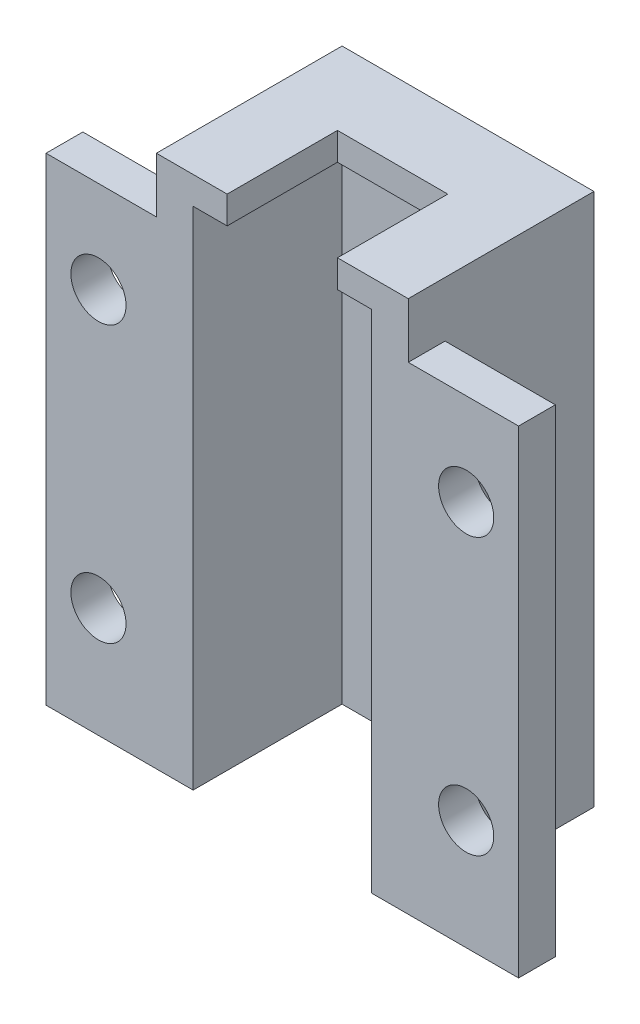
ISO-10303-21;
HEADER;
FILE_DESCRIPTION(('STEP AP214'),'2;1');
FILE_NAME('part.step','',(''),(''),'','','');
FILE_SCHEMA(('AUTOMOTIVE_DESIGN { 1 0 10303 214 1 1 1 1 }'));
ENDSEC;
DATA;
#1=APPLICATION_CONTEXT('core data for automotive mechanical design processes');
#2=APPLICATION_PROTOCOL_DEFINITION('international standard','automotive_design',2000,#1);
#3=PRODUCT_CONTEXT('',#1,'mechanical');
#4=PRODUCT('Part','Part','',(#3));
#5=PRODUCT_RELATED_PRODUCT_CATEGORY('part','',(#4));
#6=PRODUCT_DEFINITION_FORMATION('','',#4);
#7=PRODUCT_DEFINITION_CONTEXT('part definition',#1,'design');
#8=PRODUCT_DEFINITION('design','',#6,#7);
#9=PRODUCT_DEFINITION_SHAPE('','',#8);
#10=(LENGTH_UNIT() NAMED_UNIT(*) SI_UNIT(.MILLI.,.METRE.));
#11=(NAMED_UNIT(*) PLANE_ANGLE_UNIT() SI_UNIT($,.RADIAN.));
#12=(NAMED_UNIT(*) SI_UNIT($,.STERADIAN.) SOLID_ANGLE_UNIT());
#13=UNCERTAINTY_MEASURE_WITH_UNIT(LENGTH_MEASURE(1.E-05),#10,'distance_accuracy_value','');
#14=(GEOMETRIC_REPRESENTATION_CONTEXT(3) GLOBAL_UNCERTAINTY_ASSIGNED_CONTEXT((#13)) GLOBAL_UNIT_ASSIGNED_CONTEXT((#10,
#11,#12)) REPRESENTATION_CONTEXT('',''));
#15=CARTESIAN_POINT('',(0.,0.,0.));
#16=DIRECTION('',(0.,0.,1.));
#17=DIRECTION('',(1.,0.,0.));
#18=AXIS2_PLACEMENT_3D('',#15,#16,#17);
#19=CARTESIAN_POINT('',(6.1595,-36.83,0.));
#20=DIRECTION('',(-1.,0.,0.));
#21=DIRECTION('',(0.,0.,1.));
#22=AXIS2_PLACEMENT_3D('',#19,#20,#21);
#23=PLANE('',#22);
#24=DIRECTION('',(0.,1.,0.));
#25=VECTOR('',#24,1.);
#26=CARTESIAN_POINT('',(6.1595,-36.83,0.));
#27=LINE('',#26,#25);
#28=CARTESIAN_POINT('',(6.1595,-36.83,0.));
#29=VERTEX_POINT('',#28);
#30=CARTESIAN_POINT('',(6.1595,-1.905,0.));
#31=VERTEX_POINT('',#30);
#32=EDGE_CURVE('E156',#29,#31,#27,.T.);
#33=ORIENTED_EDGE('',*,*,#32,.T.);
#34=DIRECTION('',(0.,0.,-1.));
#35=VECTOR('',#34,1.);
#36=CARTESIAN_POINT('',(6.1595,-1.905,0.));
#37=LINE('',#36,#35);
#38=CARTESIAN_POINT('',(6.1595,-1.905,-10.287));
#39=VERTEX_POINT('',#38);
#40=EDGE_CURVE('E135',#31,#39,#37,.T.);
#41=ORIENTED_EDGE('',*,*,#40,.T.);
#42=DIRECTION('',(0.,1.,0.));
#43=VECTOR('',#42,1.);
#44=CARTESIAN_POINT('',(6.1595,-36.83,-10.287));
#45=LINE('',#44,#43);
#46=CARTESIAN_POINT('',(6.1595,-36.83,-10.287));
#47=VERTEX_POINT('',#46);
#48=EDGE_CURVE('E159',#47,#39,#45,.T.);
#49=ORIENTED_EDGE('',*,*,#48,.F.);
#50=DIRECTION('',(0.,0.,1.));
#51=VECTOR('',#50,1.);
#52=CARTESIAN_POINT('',(6.1595,-36.83,0.));
#53=LINE('',#52,#51);
#54=EDGE_CURVE('E249',#47,#29,#53,.T.);
#55=ORIENTED_EDGE('',*,*,#54,.T.);
#56=EDGE_LOOP('',(#33,#41,#49,#55));
#57=FACE_BOUND('',#56,.T.);
#58=ADVANCED_FACE('F33',(#57),#23,.T.);
#59=CARTESIAN_POINT('',(6.1595,-36.83,-10.287));
#60=DIRECTION('',(0.,0.,1.));
#61=DIRECTION('',(1.,0.,0.));
#62=AXIS2_PLACEMENT_3D('',#59,#60,#61);
#63=PLANE('',#62);
#64=ORIENTED_EDGE('',*,*,#48,.T.);
#65=DIRECTION('',(-1.,0.,0.));
#66=VECTOR('',#65,1.);
#67=CARTESIAN_POINT('',(6.1595,-1.905,-10.287));
#68=LINE('',#67,#66);
#69=CARTESIAN_POINT('',(-6.1595,-1.905,-10.287));
#70=VERTEX_POINT('',#69);
#71=EDGE_CURVE('E232',#39,#70,#68,.T.);
#72=ORIENTED_EDGE('',*,*,#71,.T.);
#73=DIRECTION('',(0.,1.,0.));
#74=VECTOR('',#73,1.);
#75=CARTESIAN_POINT('',(-6.1595,-36.83,-10.287));
#76=LINE('',#75,#74);
#77=CARTESIAN_POINT('',(-6.1595,-36.83,-10.287));
#78=VERTEX_POINT('',#77);
#79=EDGE_CURVE('E162',#78,#70,#76,.T.);
#80=ORIENTED_EDGE('',*,*,#79,.F.);
#81=DIRECTION('',(1.,0.,0.));
#82=VECTOR('',#81,1.);
#83=CARTESIAN_POINT('',(-6.1595,-36.83,-10.287));
#84=LINE('',#83,#82);
#85=EDGE_CURVE('E246',#78,#47,#84,.T.);
#86=ORIENTED_EDGE('',*,*,#85,.T.);
#87=EDGE_LOOP('',(#64,#72,#80,#86));
#88=FACE_BOUND('',#87,.T.);
#89=ADVANCED_FACE('F244',(#88),#63,.T.);
#90=CARTESIAN_POINT('',(-6.1595,-36.83,0.));
#91=DIRECTION('',(1.,0.,0.));
#92=DIRECTION('',(0.,0.,-1.));
#93=AXIS2_PLACEMENT_3D('',#90,#91,#92);
#94=PLANE('',#93);
#95=ORIENTED_EDGE('',*,*,#79,.T.);
#96=DIRECTION('',(0.,0.,1.));
#97=VECTOR('',#96,1.);
#98=CARTESIAN_POINT('',(-6.1595,-1.905,0.));
#99=LINE('',#98,#97);
#100=CARTESIAN_POINT('',(-6.1595,-1.905,0.));
#101=VERTEX_POINT('',#100);
#102=EDGE_CURVE('E230',#70,#101,#99,.T.);
#103=ORIENTED_EDGE('',*,*,#102,.T.);
#104=DIRECTION('',(0.,1.,0.));
#105=VECTOR('',#104,1.);
#106=CARTESIAN_POINT('',(-6.1595,-36.83,0.));
#107=LINE('',#106,#105);
#108=CARTESIAN_POINT('',(-6.1595,-36.83,0.));
#109=VERTEX_POINT('',#108);
#110=EDGE_CURVE('E164',#109,#101,#107,.T.);
#111=ORIENTED_EDGE('',*,*,#110,.F.);
#112=DIRECTION('',(0.,0.,-1.));
#113=VECTOR('',#112,1.);
#114=CARTESIAN_POINT('',(-6.1595,-36.83,0.));
#115=LINE('',#114,#113);
#116=EDGE_CURVE('E250',#109,#78,#115,.T.);
#117=ORIENTED_EDGE('',*,*,#116,.T.);
#118=EDGE_LOOP('',(#95,#103,#111,#117));
#119=FACE_BOUND('',#118,.T.);
#120=ADVANCED_FACE('F319',(#119),#94,.T.);
#121=CARTESIAN_POINT('',(-16.3195,-36.83,-2.54));
#122=DIRECTION('',(-1.,0.,0.));
#123=DIRECTION('',(0.,0.,1.));
#124=AXIS2_PLACEMENT_3D('',#121,#122,#123);
#125=PLANE('',#124);
#126=DIRECTION('',(0.,0.,-1.));
#127=VECTOR('',#126,1.);
#128=CARTESIAN_POINT('',(-16.3195,-3.81,0.));
#129=LINE('',#128,#127);
#130=CARTESIAN_POINT('',(-16.3195,-3.81,0.));
#131=VERTEX_POINT('',#130);
#132=CARTESIAN_POINT('',(-16.3195,-3.81,-2.54));
#133=VERTEX_POINT('',#132);
#134=EDGE_CURVE('E171',#131,#133,#129,.T.);
#135=ORIENTED_EDGE('',*,*,#134,.T.);
#136=DIRECTION('',(0.,1.,0.));
#137=VECTOR('',#136,1.);
#138=CARTESIAN_POINT('',(-16.3195,-36.83,-2.54));
#139=LINE('',#138,#137);
#140=CARTESIAN_POINT('',(-16.3195,-36.83,-2.54));
#141=VERTEX_POINT('',#140);
#142=EDGE_CURVE('E11',#141,#133,#139,.T.);
#143=ORIENTED_EDGE('',*,*,#142,.F.);
#144=DIRECTION('',(0.,0.,1.));
#145=VECTOR('',#144,1.);
#146=CARTESIAN_POINT('',(-16.3195,-36.83,-2.54));
#147=LINE('',#146,#145);
#148=CARTESIAN_POINT('',(-16.3195,-36.83,0.));
#149=VERTEX_POINT('',#148);
#150=EDGE_CURVE('E143',#141,#149,#147,.T.);
#151=ORIENTED_EDGE('',*,*,#150,.T.);
#152=DIRECTION('',(0.,1.,0.));
#153=VECTOR('',#152,1.);
#154=CARTESIAN_POINT('',(-16.3195,-36.83,0.));
#155=LINE('',#154,#153);
#156=EDGE_CURVE('E37',#149,#131,#155,.T.);
#157=ORIENTED_EDGE('',*,*,#156,.T.);
#158=EDGE_LOOP('',(#135,#143,#151,#157));
#159=FACE_BOUND('',#158,.T.);
#160=ADVANCED_FACE('F35',(#159),#125,.T.);
#161=CARTESIAN_POINT('',(-16.3195,-36.83,-2.54));
#162=DIRECTION('',(0.,0.,-1.));
#163=DIRECTION('',(-1.,0.,0.));
#164=AXIS2_PLACEMENT_3D('',#161,#162,#163);
#165=PLANE('',#164);
#166=DIRECTION('',(-1.,0.,0.));
#167=VECTOR('',#166,1.);
#168=CARTESIAN_POINT('',(-16.3195,-3.81,-2.54));
#169=LINE('',#168,#167);
#170=CARTESIAN_POINT('',(-8.6995,-3.81,-2.54));
#171=VERTEX_POINT('',#170);
#172=EDGE_CURVE('E393',#171,#133,#169,.T.);
#173=ORIENTED_EDGE('',*,*,#172,.F.);
#174=DIRECTION('',(0.,1.,0.));
#175=VECTOR('',#174,1.);
#176=CARTESIAN_POINT('',(-8.6995,-36.83,-2.54));
#177=LINE('',#176,#175);
#178=CARTESIAN_POINT('',(-8.6995,-36.83,-2.54));
#179=VERTEX_POINT('',#178);
#180=EDGE_CURVE('E42',#179,#171,#177,.T.);
#181=ORIENTED_EDGE('',*,*,#180,.F.);
#182=DIRECTION('',(-1.,0.,0.));
#183=VECTOR('',#182,1.);
#184=CARTESIAN_POINT('',(-16.3195,-36.83,-2.54));
#185=LINE('',#184,#183);
#186=EDGE_CURVE('E127',#179,#141,#185,.T.);
#187=ORIENTED_EDGE('',*,*,#186,.T.);
#188=ORIENTED_EDGE('',*,*,#142,.T.);
#189=EDGE_LOOP('',(#173,#181,#187,#188));
#190=FACE_BOUND('',#189,.T.);
#191=CARTESIAN_POINT('',(-12.7,-10.16,-2.54));
#192=DIRECTION('',(0.,0.,-1.));
#193=DIRECTION('',(1.,0.,0.));
#194=AXIS2_PLACEMENT_3D('',#191,#192,#193);
#195=CIRCLE('',#194,1.905);
#196=CARTESIAN_POINT('',(-10.795,-10.16,-2.54));
#197=VERTEX_POINT('',#196);
#198=EDGE_CURVE('E411',#197,#197,#195,.T.);
#199=ORIENTED_EDGE('',*,*,#198,.F.);
#200=EDGE_LOOP('',(#199));
#201=FACE_BOUND('',#200,.T.);
#202=CARTESIAN_POINT('',(-12.7,-29.21,-2.54));
#203=DIRECTION('',(0.,0.,-1.));
#204=DIRECTION('',(1.,0.,0.));
#205=AXIS2_PLACEMENT_3D('',#202,#203,#204);
#206=CIRCLE('',#205,1.905);
#207=CARTESIAN_POINT('',(-10.795,-29.21,-2.54));
#208=VERTEX_POINT('',#207);
#209=EDGE_CURVE('E416',#208,#208,#206,.T.);
#210=ORIENTED_EDGE('',*,*,#209,.F.);
#211=EDGE_LOOP('',(#210));
#212=FACE_BOUND('',#211,.T.);
#213=ADVANCED_FACE('F327',(#190,#201,#212),#165,.T.);
#214=CARTESIAN_POINT('',(-8.6995,-36.83,-2.54));
#215=DIRECTION('',(-1.,0.,0.));
#216=DIRECTION('',(0.,0.,1.));
#217=AXIS2_PLACEMENT_3D('',#214,#215,#216);
#218=PLANE('',#217);
#219=DIRECTION('',(0.,0.,1.));
#220=VECTOR('',#219,1.);
#221=CARTESIAN_POINT('',(-8.6995,0.,-2.54));
#222=LINE('',#221,#220);
#223=CARTESIAN_POINT('',(-8.6995,0.,-12.827));
#224=VERTEX_POINT('',#223);
#225=CARTESIAN_POINT('',(-8.6995,0.,0.));
#226=VERTEX_POINT('',#225);
#227=EDGE_CURVE('E50',#224,#226,#222,.T.);
#228=ORIENTED_EDGE('',*,*,#227,.F.);
#229=DIRECTION('',(0.,1.,0.));
#230=VECTOR('',#229,1.);
#231=CARTESIAN_POINT('',(-8.6995,-36.83,-12.827));
#232=LINE('',#231,#230);
#233=CARTESIAN_POINT('',(-8.6995,-36.83,-12.827));
#234=VERTEX_POINT('',#233);
#235=EDGE_CURVE('E74',#234,#224,#232,.T.);
#236=ORIENTED_EDGE('',*,*,#235,.F.);
#237=DIRECTION('',(0.,0.,1.));
#238=VECTOR('',#237,1.);
#239=CARTESIAN_POINT('',(-8.6995,-36.83,-2.54));
#240=LINE('',#239,#238);
#241=EDGE_CURVE('E116',#234,#179,#240,.T.);
#242=ORIENTED_EDGE('',*,*,#241,.T.);
#243=ORIENTED_EDGE('',*,*,#180,.T.);
#244=DIRECTION('',(0.,0.,-1.));
#245=VECTOR('',#244,1.);
#246=CARTESIAN_POINT('',(-8.6995,-3.81,0.));
#247=LINE('',#246,#245);
#248=CARTESIAN_POINT('',(-8.6995,-3.81,0.));
#249=VERTEX_POINT('',#248);
#250=EDGE_CURVE('E394',#249,#171,#247,.T.);
#251=ORIENTED_EDGE('',*,*,#250,.F.);
#252=DIRECTION('',(0.,-1.,0.));
#253=VECTOR('',#252,1.);
#254=CARTESIAN_POINT('',(-8.6995,0.,0.));
#255=LINE('',#254,#253);
#256=EDGE_CURVE('E395',#226,#249,#255,.T.);
#257=ORIENTED_EDGE('',*,*,#256,.F.);
#258=EDGE_LOOP('',(#228,#236,#242,#243,#251,#257));
#259=FACE_BOUND('',#258,.T.);
#260=ADVANCED_FACE('F121',(#259),#218,.T.);
#261=CARTESIAN_POINT('',(-8.6995,-36.83,-12.827));
#262=DIRECTION('',(0.,0.,-1.));
#263=DIRECTION('',(-1.,0.,0.));
#264=AXIS2_PLACEMENT_3D('',#261,#262,#263);
#265=PLANE('',#264);
#266=DIRECTION('',(-1.,0.,0.));
#267=VECTOR('',#266,1.);
#268=CARTESIAN_POINT('',(-8.6995,0.,-12.827));
#269=LINE('',#268,#267);
#270=CARTESIAN_POINT('',(8.6995,0.,-12.827));
#271=VERTEX_POINT('',#270);
#272=EDGE_CURVE('E141',#271,#224,#269,.T.);
#273=ORIENTED_EDGE('',*,*,#272,.F.);
#274=DIRECTION('',(0.,1.,0.));
#275=VECTOR('',#274,1.);
#276=CARTESIAN_POINT('',(8.6995,-36.83,-12.827));
#277=LINE('',#276,#275);
#278=CARTESIAN_POINT('',(8.6995,-36.83,-12.827));
#279=VERTEX_POINT('',#278);
#280=EDGE_CURVE('E111',#279,#271,#277,.T.);
#281=ORIENTED_EDGE('',*,*,#280,.F.);
#282=DIRECTION('',(-1.,0.,0.));
#283=VECTOR('',#282,1.);
#284=CARTESIAN_POINT('',(8.6995,-36.83,-12.827));
#285=LINE('',#284,#283);
#286=EDGE_CURVE('E109',#279,#234,#285,.T.);
#287=ORIENTED_EDGE('',*,*,#286,.T.);
#288=ORIENTED_EDGE('',*,*,#235,.T.);
#289=EDGE_LOOP('',(#273,#281,#287,#288));
#290=FACE_BOUND('',#289,.T.);
#291=ADVANCED_FACE('F110',(#290),#265,.T.);
#292=CARTESIAN_POINT('',(8.6995,-36.83,-2.54));
#293=DIRECTION('',(1.,0.,0.));
#294=DIRECTION('',(0.,0.,-1.));
#295=AXIS2_PLACEMENT_3D('',#292,#293,#294);
#296=PLANE('',#295);
#297=DIRECTION('',(0.,0.,-1.));
#298=VECTOR('',#297,1.);
#299=CARTESIAN_POINT('',(8.6995,0.,-2.54));
#300=LINE('',#299,#298);
#301=CARTESIAN_POINT('',(8.6995,0.,0.));
#302=VERTEX_POINT('',#301);
#303=EDGE_CURVE('E138',#302,#271,#300,.T.);
#304=ORIENTED_EDGE('',*,*,#303,.F.);
#305=DIRECTION('',(0.,1.,0.));
#306=VECTOR('',#305,1.);
#307=CARTESIAN_POINT('',(8.6995,0.,0.));
#308=LINE('',#307,#306);
#309=CARTESIAN_POINT('',(8.6995,-3.81,0.));
#310=VERTEX_POINT('',#309);
#311=EDGE_CURVE('E406',#310,#302,#308,.T.);
#312=ORIENTED_EDGE('',*,*,#311,.F.);
#313=DIRECTION('',(0.,0.,-1.));
#314=VECTOR('',#313,1.);
#315=CARTESIAN_POINT('',(8.6995,-3.81,0.));
#316=LINE('',#315,#314);
#317=CARTESIAN_POINT('',(8.6995,-3.81,-2.54));
#318=VERTEX_POINT('',#317);
#319=EDGE_CURVE('E409',#310,#318,#316,.T.);
#320=ORIENTED_EDGE('',*,*,#319,.T.);
#321=DIRECTION('',(0.,1.,0.));
#322=VECTOR('',#321,1.);
#323=CARTESIAN_POINT('',(8.6995,-36.83,-2.54));
#324=LINE('',#323,#322);
#325=CARTESIAN_POINT('',(8.6995,-36.83,-2.54));
#326=VERTEX_POINT('',#325);
#327=EDGE_CURVE('E147',#326,#318,#324,.T.);
#328=ORIENTED_EDGE('',*,*,#327,.F.);
#329=DIRECTION('',(0.,0.,-1.));
#330=VECTOR('',#329,1.);
#331=CARTESIAN_POINT('',(8.6995,-36.83,-2.54));
#332=LINE('',#331,#330);
#333=EDGE_CURVE('E117',#326,#279,#332,.T.);
#334=ORIENTED_EDGE('',*,*,#333,.T.);
#335=ORIENTED_EDGE('',*,*,#280,.T.);
#336=EDGE_LOOP('',(#304,#312,#320,#328,#334,#335));
#337=FACE_BOUND('',#336,.T.);
#338=ADVANCED_FACE('F266',(#337),#296,.T.);
#339=CARTESIAN_POINT('',(16.3195,-36.83,-2.54));
#340=DIRECTION('',(0.,0.,-1.));
#341=DIRECTION('',(-1.,0.,0.));
#342=AXIS2_PLACEMENT_3D('',#339,#340,#341);
#343=PLANE('',#342);
#344=DIRECTION('',(-1.,0.,0.));
#345=VECTOR('',#344,1.);
#346=CARTESIAN_POINT('',(16.3195,-3.81,-2.54));
#347=LINE('',#346,#345);
#348=CARTESIAN_POINT('',(16.3195,-3.81,-2.54));
#349=VERTEX_POINT('',#348);
#350=EDGE_CURVE('E274',#349,#318,#347,.T.);
#351=ORIENTED_EDGE('',*,*,#350,.F.);
#352=DIRECTION('',(0.,1.,0.));
#353=VECTOR('',#352,1.);
#354=CARTESIAN_POINT('',(16.3195,-36.83,-2.54));
#355=LINE('',#354,#353);
#356=CARTESIAN_POINT('',(16.3195,-36.83,-2.54));
#357=VERTEX_POINT('',#356);
#358=EDGE_CURVE('E150',#357,#349,#355,.T.);
#359=ORIENTED_EDGE('',*,*,#358,.F.);
#360=DIRECTION('',(-1.,0.,0.));
#361=VECTOR('',#360,1.);
#362=CARTESIAN_POINT('',(16.3195,-36.83,-2.54));
#363=LINE('',#362,#361);
#364=EDGE_CURVE('E263',#357,#326,#363,.T.);
#365=ORIENTED_EDGE('',*,*,#364,.T.);
#366=ORIENTED_EDGE('',*,*,#327,.T.);
#367=EDGE_LOOP('',(#351,#359,#365,#366));
#368=FACE_BOUND('',#367,.T.);
#369=CARTESIAN_POINT('',(12.7,-29.21,-2.54));
#370=DIRECTION('',(0.,0.,-1.));
#371=DIRECTION('',(-1.,0.,0.));
#372=AXIS2_PLACEMENT_3D('',#369,#370,#371);
#373=CIRCLE('',#372,1.905);
#374=CARTESIAN_POINT('',(10.795,-29.21,-2.54));
#375=VERTEX_POINT('',#374);
#376=EDGE_CURVE('E422',#375,#375,#373,.T.);
#377=ORIENTED_EDGE('',*,*,#376,.F.);
#378=EDGE_LOOP('',(#377));
#379=FACE_BOUND('',#378,.T.);
#380=CARTESIAN_POINT('',(12.7,-10.16,-2.54));
#381=DIRECTION('',(0.,0.,-1.));
#382=DIRECTION('',(-1.,0.,0.));
#383=AXIS2_PLACEMENT_3D('',#380,#381,#382);
#384=CIRCLE('',#383,1.905);
#385=CARTESIAN_POINT('',(10.795,-10.16,-2.54));
#386=VERTEX_POINT('',#385);
#387=EDGE_CURVE('E428',#386,#386,#384,.T.);
#388=ORIENTED_EDGE('',*,*,#387,.F.);
#389=EDGE_LOOP('',(#388));
#390=FACE_BOUND('',#389,.T.);
#391=ADVANCED_FACE('F271',(#368,#379,#390),#343,.T.);
#392=CARTESIAN_POINT('',(16.3195,-36.83,-2.54));
#393=DIRECTION('',(1.,0.,0.));
#394=DIRECTION('',(0.,0.,-1.));
#395=AXIS2_PLACEMENT_3D('',#392,#393,#394);
#396=PLANE('',#395);
#397=DIRECTION('',(0.,0.,-1.));
#398=VECTOR('',#397,1.);
#399=CARTESIAN_POINT('',(16.3195,-3.81,0.));
#400=LINE('',#399,#398);
#401=CARTESIAN_POINT('',(16.3195,-3.81,0.));
#402=VERTEX_POINT('',#401);
#403=EDGE_CURVE('E278',#402,#349,#400,.T.);
#404=ORIENTED_EDGE('',*,*,#403,.F.);
#405=DIRECTION('',(0.,1.,0.));
#406=VECTOR('',#405,1.);
#407=CARTESIAN_POINT('',(16.3195,-36.83,0.));
#408=LINE('',#407,#406);
#409=CARTESIAN_POINT('',(16.3195,-36.83,0.));
#410=VERTEX_POINT('',#409);
#411=EDGE_CURVE('E153',#410,#402,#408,.T.);
#412=ORIENTED_EDGE('',*,*,#411,.F.);
#413=DIRECTION('',(0.,0.,-1.));
#414=VECTOR('',#413,1.);
#415=CARTESIAN_POINT('',(16.3195,-36.83,-2.54));
#416=LINE('',#415,#414);
#417=EDGE_CURVE('E260',#410,#357,#416,.T.);
#418=ORIENTED_EDGE('',*,*,#417,.T.);
#419=ORIENTED_EDGE('',*,*,#358,.T.);
#420=EDGE_LOOP('',(#404,#412,#418,#419));
#421=FACE_BOUND('',#420,.T.);
#422=ADVANCED_FACE('F277',(#421),#396,.T.);
#423=CARTESIAN_POINT('',(16.3195,-36.83,0.));
#424=DIRECTION('',(0.,0.,1.));
#425=DIRECTION('',(1.,0.,0.));
#426=AXIS2_PLACEMENT_3D('',#423,#424,#425);
#427=PLANE('',#426);
#428=ORIENTED_EDGE('',*,*,#311,.T.);
#429=DIRECTION('',(1.,0.,0.));
#430=VECTOR('',#429,1.);
#431=CARTESIAN_POINT('',(16.3195,0.,0.));
#432=LINE('',#431,#430);
#433=CARTESIAN_POINT('',(3.81,0.,0.));
#434=VERTEX_POINT('',#433);
#435=EDGE_CURVE('E134',#434,#302,#432,.T.);
#436=ORIENTED_EDGE('',*,*,#435,.F.);
#437=DIRECTION('',(0.,1.,0.));
#438=VECTOR('',#437,1.);
#439=CARTESIAN_POINT('',(3.81,-1.905,0.));
#440=LINE('',#439,#438);
#441=CARTESIAN_POINT('',(3.81,-1.905,0.));
#442=VERTEX_POINT('',#441);
#443=EDGE_CURVE('E287',#442,#434,#440,.T.);
#444=ORIENTED_EDGE('',*,*,#443,.F.);
#445=DIRECTION('',(1.,0.,0.));
#446=VECTOR('',#445,1.);
#447=CARTESIAN_POINT('',(8.6995,-1.905,0.));
#448=LINE('',#447,#446);
#449=EDGE_CURVE('E285',#442,#31,#448,.T.);
#450=ORIENTED_EDGE('',*,*,#449,.T.);
#451=ORIENTED_EDGE('',*,*,#32,.F.);
#452=DIRECTION('',(1.,0.,0.));
#453=VECTOR('',#452,1.);
#454=CARTESIAN_POINT('',(16.3195,-36.83,0.));
#455=LINE('',#454,#453);
#456=EDGE_CURVE('E252',#29,#410,#455,.T.);
#457=ORIENTED_EDGE('',*,*,#456,.T.);
#458=ORIENTED_EDGE('',*,*,#411,.T.);
#459=DIRECTION('',(-1.,0.,0.));
#460=VECTOR('',#459,1.);
#461=CARTESIAN_POINT('',(16.3195,-3.81,0.));
#462=LINE('',#461,#460);
#463=EDGE_CURVE('E404',#402,#310,#462,.T.);
#464=ORIENTED_EDGE('',*,*,#463,.T.);
#465=EDGE_LOOP('',(#428,#436,#444,#450,#451,#457,#458,#464));
#466=FACE_BOUND('',#465,.T.);
#467=CARTESIAN_POINT('',(12.7,-29.21,0.));
#468=DIRECTION('',(0.,0.,-1.));
#469=DIRECTION('',(-1.,0.,0.));
#470=AXIS2_PLACEMENT_3D('',#467,#468,#469);
#471=CIRCLE('',#470,1.905);
#472=CARTESIAN_POINT('',(10.795,-29.21,0.));
#473=VERTEX_POINT('',#472);
#474=EDGE_CURVE('E425',#473,#473,#471,.T.);
#475=ORIENTED_EDGE('',*,*,#474,.T.);
#476=EDGE_LOOP('',(#475));
#477=FACE_BOUND('',#476,.T.);
#478=CARTESIAN_POINT('',(12.7,-10.16,0.));
#479=DIRECTION('',(0.,0.,-1.));
#480=DIRECTION('',(-1.,0.,0.));
#481=AXIS2_PLACEMENT_3D('',#478,#479,#480);
#482=CIRCLE('',#481,1.905);
#483=CARTESIAN_POINT('',(10.795,-10.16,0.));
#484=VERTEX_POINT('',#483);
#485=EDGE_CURVE('E304',#484,#484,#482,.T.);
#486=ORIENTED_EDGE('',*,*,#485,.T.);
#487=EDGE_LOOP('',(#486));
#488=FACE_BOUND('',#487,.T.);
#489=ADVANCED_FACE('F282',(#466,#477,#488),#427,.T.);
#490=CARTESIAN_POINT('',(-16.3195,-36.83,0.));
#491=DIRECTION('',(0.,0.,1.));
#492=DIRECTION('',(1.,0.,0.));
#493=AXIS2_PLACEMENT_3D('',#490,#491,#492);
#494=PLANE('',#493);
#495=DIRECTION('',(-1.,0.,0.));
#496=VECTOR('',#495,1.);
#497=CARTESIAN_POINT('',(-16.3195,-3.81,0.));
#498=LINE('',#497,#496);
#499=EDGE_CURVE('E398',#249,#131,#498,.T.);
#500=ORIENTED_EDGE('',*,*,#499,.T.);
#501=ORIENTED_EDGE('',*,*,#156,.F.);
#502=DIRECTION('',(1.,0.,0.));
#503=VECTOR('',#502,1.);
#504=CARTESIAN_POINT('',(-16.3195,-36.83,0.));
#505=LINE('',#504,#503);
#506=EDGE_CURVE('E254',#149,#109,#505,.T.);
#507=ORIENTED_EDGE('',*,*,#506,.T.);
#508=ORIENTED_EDGE('',*,*,#110,.T.);
#509=DIRECTION('',(1.,0.,0.));
#510=VECTOR('',#509,1.);
#511=CARTESIAN_POINT('',(-8.6995,-1.905,0.));
#512=LINE('',#511,#510);
#513=CARTESIAN_POINT('',(-3.81,-1.905,0.));
#514=VERTEX_POINT('',#513);
#515=EDGE_CURVE('E310',#101,#514,#512,.T.);
#516=ORIENTED_EDGE('',*,*,#515,.T.);
#517=DIRECTION('',(0.,1.,0.));
#518=VECTOR('',#517,1.);
#519=CARTESIAN_POINT('',(-3.81,-1.905,0.));
#520=LINE('',#519,#518);
#521=CARTESIAN_POINT('',(-3.81,0.,0.));
#522=VERTEX_POINT('',#521);
#523=EDGE_CURVE('E290',#514,#522,#520,.T.);
#524=ORIENTED_EDGE('',*,*,#523,.T.);
#525=DIRECTION('',(1.,0.,0.));
#526=VECTOR('',#525,1.);
#527=CARTESIAN_POINT('',(-16.3195,0.,0.));
#528=LINE('',#527,#526);
#529=EDGE_CURVE('E132',#226,#522,#528,.T.);
#530=ORIENTED_EDGE('',*,*,#529,.F.);
#531=ORIENTED_EDGE('',*,*,#256,.T.);
#532=EDGE_LOOP('',(#500,#501,#507,#508,#516,#524,#530,#531));
#533=FACE_BOUND('',#532,.T.);
#534=CARTESIAN_POINT('',(-12.7,-10.16,0.));
#535=DIRECTION('',(0.,0.,-1.));
#536=DIRECTION('',(1.,0.,0.));
#537=AXIS2_PLACEMENT_3D('',#534,#535,#536);
#538=CIRCLE('',#537,1.905);
#539=CARTESIAN_POINT('',(-10.795,-10.16,0.));
#540=VERTEX_POINT('',#539);
#541=EDGE_CURVE('E413',#540,#540,#538,.T.);
#542=ORIENTED_EDGE('',*,*,#541,.T.);
#543=EDGE_LOOP('',(#542));
#544=FACE_BOUND('',#543,.T.);
#545=CARTESIAN_POINT('',(-12.7,-29.21,0.));
#546=DIRECTION('',(0.,0.,-1.));
#547=DIRECTION('',(1.,0.,0.));
#548=AXIS2_PLACEMENT_3D('',#545,#546,#547);
#549=CIRCLE('',#548,1.905);
#550=CARTESIAN_POINT('',(-10.795,-29.21,0.));
#551=VERTEX_POINT('',#550);
#552=EDGE_CURVE('E419',#551,#551,#549,.T.);
#553=ORIENTED_EDGE('',*,*,#552,.T.);
#554=EDGE_LOOP('',(#553));
#555=FACE_BOUND('',#554,.T.);
#556=ADVANCED_FACE('F316',(#533,#544,#555),#494,.T.);
#557=CARTESIAN_POINT('',(0.,-36.83,0.));
#558=DIRECTION('',(0.,1.,0.));
#559=DIRECTION('',(0.,0.,1.));
#560=AXIS2_PLACEMENT_3D('',#557,#558,#559);
#561=PLANE('',#560);
#562=ORIENTED_EDGE('',*,*,#150,.F.);
#563=ORIENTED_EDGE('',*,*,#186,.F.);
#564=ORIENTED_EDGE('',*,*,#241,.F.);
#565=ORIENTED_EDGE('',*,*,#286,.F.);
#566=ORIENTED_EDGE('',*,*,#333,.F.);
#567=ORIENTED_EDGE('',*,*,#364,.F.);
#568=ORIENTED_EDGE('',*,*,#417,.F.);
#569=ORIENTED_EDGE('',*,*,#456,.F.);
#570=ORIENTED_EDGE('',*,*,#54,.F.);
#571=ORIENTED_EDGE('',*,*,#85,.F.);
#572=ORIENTED_EDGE('',*,*,#116,.F.);
#573=ORIENTED_EDGE('',*,*,#506,.F.);
#574=EDGE_LOOP('',(#562,#563,#564,#565,#566,#567,#568,#569,#570,#571,#572,#573));
#575=FACE_BOUND('',#574,.T.);
#576=ADVANCED_FACE('F125',(#575),#561,.F.);
#577=CARTESIAN_POINT('',(0.,0.,0.));
#578=DIRECTION('',(0.,1.,0.));
#579=DIRECTION('',(0.,0.,1.));
#580=AXIS2_PLACEMENT_3D('',#577,#578,#579);
#581=PLANE('',#580);
#582=ORIENTED_EDGE('',*,*,#227,.T.);
#583=ORIENTED_EDGE('',*,*,#529,.T.);
#584=DIRECTION('',(0.,0.,-1.));
#585=VECTOR('',#584,1.);
#586=CARTESIAN_POINT('',(-3.81,0.,0.));
#587=LINE('',#586,#585);
#588=CARTESIAN_POINT('',(-3.81,0.,-7.62));
#589=VERTEX_POINT('',#588);
#590=EDGE_CURVE('E300',#522,#589,#587,.T.);
#591=ORIENTED_EDGE('',*,*,#590,.T.);
#592=DIRECTION('',(1.,0.,0.));
#593=VECTOR('',#592,1.);
#594=CARTESIAN_POINT('',(-3.81,0.,-7.62));
#595=LINE('',#594,#593);
#596=CARTESIAN_POINT('',(3.81,0.,-7.62));
#597=VERTEX_POINT('',#596);
#598=EDGE_CURVE('E303',#589,#597,#595,.T.);
#599=ORIENTED_EDGE('',*,*,#598,.T.);
#600=DIRECTION('',(0.,0.,1.));
#601=VECTOR('',#600,1.);
#602=CARTESIAN_POINT('',(3.81,0.,0.));
#603=LINE('',#602,#601);
#604=EDGE_CURVE('E307',#597,#434,#603,.T.);
#605=ORIENTED_EDGE('',*,*,#604,.T.);
#606=ORIENTED_EDGE('',*,*,#435,.T.);
#607=ORIENTED_EDGE('',*,*,#303,.T.);
#608=ORIENTED_EDGE('',*,*,#272,.T.);
#609=EDGE_LOOP('',(#582,#583,#591,#599,#605,#606,#607,#608));
#610=FACE_BOUND('',#609,.T.);
#611=ADVANCED_FACE('F349',(#610),#581,.T.);
#612=CARTESIAN_POINT('',(3.81,-1.905,0.));
#613=DIRECTION('',(-1.,0.,0.));
#614=DIRECTION('',(0.,0.,1.));
#615=AXIS2_PLACEMENT_3D('',#612,#613,#614);
#616=PLANE('',#615);
#617=ORIENTED_EDGE('',*,*,#604,.F.);
#618=DIRECTION('',(0.,1.,0.));
#619=VECTOR('',#618,1.);
#620=CARTESIAN_POINT('',(3.81,-1.905,-7.62));
#621=LINE('',#620,#619);
#622=CARTESIAN_POINT('',(3.81,-1.905,-7.62));
#623=VERTEX_POINT('',#622);
#624=EDGE_CURVE('E312',#623,#597,#621,.T.);
#625=ORIENTED_EDGE('',*,*,#624,.F.);
#626=DIRECTION('',(0.,0.,1.));
#627=VECTOR('',#626,1.);
#628=CARTESIAN_POINT('',(3.81,-1.905,0.));
#629=LINE('',#628,#627);
#630=EDGE_CURVE('E291',#623,#442,#629,.T.);
#631=ORIENTED_EDGE('',*,*,#630,.T.);
#632=ORIENTED_EDGE('',*,*,#443,.T.);
#633=EDGE_LOOP('',(#617,#625,#631,#632));
#634=FACE_BOUND('',#633,.T.);
#635=ADVANCED_FACE('F352',(#634),#616,.T.);
#636=CARTESIAN_POINT('',(-3.81,-1.905,-7.62));
#637=DIRECTION('',(0.,0.,1.));
#638=DIRECTION('',(1.,0.,0.));
#639=AXIS2_PLACEMENT_3D('',#636,#637,#638);
#640=PLANE('',#639);
#641=ORIENTED_EDGE('',*,*,#598,.F.);
#642=DIRECTION('',(0.,1.,0.));
#643=VECTOR('',#642,1.);
#644=CARTESIAN_POINT('',(-3.81,-1.905,-7.62));
#645=LINE('',#644,#643);
#646=CARTESIAN_POINT('',(-3.81,-1.905,-7.62));
#647=VERTEX_POINT('',#646);
#648=EDGE_CURVE('E294',#647,#589,#645,.T.);
#649=ORIENTED_EDGE('',*,*,#648,.F.);
#650=DIRECTION('',(1.,0.,0.));
#651=VECTOR('',#650,1.);
#652=CARTESIAN_POINT('',(-3.81,-1.905,-7.62));
#653=LINE('',#652,#651);
#654=EDGE_CURVE('E296',#647,#623,#653,.T.);
#655=ORIENTED_EDGE('',*,*,#654,.T.);
#656=ORIENTED_EDGE('',*,*,#624,.T.);
#657=EDGE_LOOP('',(#641,#649,#655,#656));
#658=FACE_BOUND('',#657,.T.);
#659=ADVANCED_FACE('F358',(#658),#640,.T.);
#660=CARTESIAN_POINT('',(-3.81,-1.905,0.));
#661=DIRECTION('',(1.,0.,0.));
#662=DIRECTION('',(0.,0.,-1.));
#663=AXIS2_PLACEMENT_3D('',#660,#661,#662);
#664=PLANE('',#663);
#665=ORIENTED_EDGE('',*,*,#590,.F.);
#666=ORIENTED_EDGE('',*,*,#523,.F.);
#667=DIRECTION('',(0.,0.,-1.));
#668=VECTOR('',#667,1.);
#669=CARTESIAN_POINT('',(-3.81,-1.905,0.));
#670=LINE('',#669,#668);
#671=EDGE_CURVE('E436',#514,#647,#670,.T.);
#672=ORIENTED_EDGE('',*,*,#671,.T.);
#673=ORIENTED_EDGE('',*,*,#648,.T.);
#674=EDGE_LOOP('',(#665,#666,#672,#673));
#675=FACE_BOUND('',#674,.T.);
#676=ADVANCED_FACE('F355',(#675),#664,.T.);
#677=CARTESIAN_POINT('',(0.,-1.905,0.));
#678=DIRECTION('',(0.,1.,0.));
#679=DIRECTION('',(0.,0.,1.));
#680=AXIS2_PLACEMENT_3D('',#677,#678,#679);
#681=PLANE('',#680);
#682=ORIENTED_EDGE('',*,*,#40,.F.);
#683=ORIENTED_EDGE('',*,*,#449,.F.);
#684=ORIENTED_EDGE('',*,*,#630,.F.);
#685=ORIENTED_EDGE('',*,*,#654,.F.);
#686=ORIENTED_EDGE('',*,*,#671,.F.);
#687=ORIENTED_EDGE('',*,*,#515,.F.);
#688=ORIENTED_EDGE('',*,*,#102,.F.);
#689=ORIENTED_EDGE('',*,*,#71,.F.);
#690=EDGE_LOOP('',(#682,#683,#684,#685,#686,#687,#688,#689));
#691=FACE_BOUND('',#690,.T.);
#692=ADVANCED_FACE('F234',(#691),#681,.F.);
#693=CARTESIAN_POINT('',(12.7,-10.16,0.));
#694=DIRECTION('',(0.,0.,-1.));
#695=DIRECTION('',(-1.,0.,0.));
#696=AXIS2_PLACEMENT_3D('',#693,#694,#695);
#697=CYLINDRICAL_SURFACE('',#696,1.905);
#698=ORIENTED_EDGE('',*,*,#485,.F.);
#699=EDGE_LOOP('',(#698));
#700=FACE_BOUND('',#699,.T.);
#701=ORIENTED_EDGE('',*,*,#387,.T.);
#702=EDGE_LOOP('',(#701));
#703=FACE_BOUND('',#702,.T.);
#704=ADVANCED_FACE('F368',(#700,#703),#697,.F.);
#705=CARTESIAN_POINT('',(12.7,-29.21,0.));
#706=DIRECTION('',(0.,0.,-1.));
#707=DIRECTION('',(-1.,0.,0.));
#708=AXIS2_PLACEMENT_3D('',#705,#706,#707);
#709=CYLINDRICAL_SURFACE('',#708,1.905);
#710=ORIENTED_EDGE('',*,*,#474,.F.);
#711=EDGE_LOOP('',(#710));
#712=FACE_BOUND('',#711,.T.);
#713=ORIENTED_EDGE('',*,*,#376,.T.);
#714=EDGE_LOOP('',(#713));
#715=FACE_BOUND('',#714,.T.);
#716=ADVANCED_FACE('F371',(#712,#715),#709,.F.);
#717=CARTESIAN_POINT('',(-12.7,-29.21,0.));
#718=DIRECTION('',(0.,0.,-1.));
#719=DIRECTION('',(-1.,0.,0.));
#720=AXIS2_PLACEMENT_3D('',#717,#718,#719);
#721=CYLINDRICAL_SURFACE('',#720,1.905);
#722=ORIENTED_EDGE('',*,*,#552,.F.);
#723=EDGE_LOOP('',(#722));
#724=FACE_BOUND('',#723,.T.);
#725=ORIENTED_EDGE('',*,*,#209,.T.);
#726=EDGE_LOOP('',(#725));
#727=FACE_BOUND('',#726,.T.);
#728=ADVANCED_FACE('F375',(#724,#727),#721,.F.);
#729=CARTESIAN_POINT('',(-12.7,-10.16,0.));
#730=DIRECTION('',(0.,0.,-1.));
#731=DIRECTION('',(-1.,0.,0.));
#732=AXIS2_PLACEMENT_3D('',#729,#730,#731);
#733=CYLINDRICAL_SURFACE('',#732,1.905);
#734=ORIENTED_EDGE('',*,*,#541,.F.);
#735=EDGE_LOOP('',(#734));
#736=FACE_BOUND('',#735,.T.);
#737=ORIENTED_EDGE('',*,*,#198,.T.);
#738=EDGE_LOOP('',(#737));
#739=FACE_BOUND('',#738,.T.);
#740=ADVANCED_FACE('F379',(#736,#739),#733,.F.);
#741=CARTESIAN_POINT('',(16.3195,-3.81,0.));
#742=DIRECTION('',(0.,-1.,0.));
#743=DIRECTION('',(1.,0.,0.));
#744=AXIS2_PLACEMENT_3D('',#741,#742,#743);
#745=PLANE('',#744);
#746=ORIENTED_EDGE('',*,*,#350,.T.);
#747=ORIENTED_EDGE('',*,*,#319,.F.);
#748=ORIENTED_EDGE('',*,*,#463,.F.);
#749=ORIENTED_EDGE('',*,*,#403,.T.);
#750=EDGE_LOOP('',(#746,#747,#748,#749));
#751=FACE_BOUND('',#750,.T.);
#752=ADVANCED_FACE('F383',(#751),#745,.F.);
#753=CARTESIAN_POINT('',(-16.3195,-3.81,0.));
#754=DIRECTION('',(0.,-1.,0.));
#755=DIRECTION('',(1.,0.,0.));
#756=AXIS2_PLACEMENT_3D('',#753,#754,#755);
#757=PLANE('',#756);
#758=ORIENTED_EDGE('',*,*,#172,.T.);
#759=ORIENTED_EDGE('',*,*,#134,.F.);
#760=ORIENTED_EDGE('',*,*,#499,.F.);
#761=ORIENTED_EDGE('',*,*,#250,.T.);
#762=EDGE_LOOP('',(#758,#759,#760,#761));
#763=FACE_BOUND('',#762,.T.);
#764=ADVANCED_FACE('F387',(#763),#757,.F.);
#765=CLOSED_SHELL('',(#58,#89,#120,#160,#213,#260,#291,#338,#391,#422,#489,#556,#576,#611,#635,
#659,#676,#692,#704,#716,#728,#740,#752,#764));
#766=MANIFOLD_SOLID_BREP('B2',#765);
#767=ADVANCED_BREP_SHAPE_REPRESENTATION('',(#18,#766),#14);
#768=SHAPE_DEFINITION_REPRESENTATION(#9,#767);
ENDSEC;
END-ISO-10303-21;
